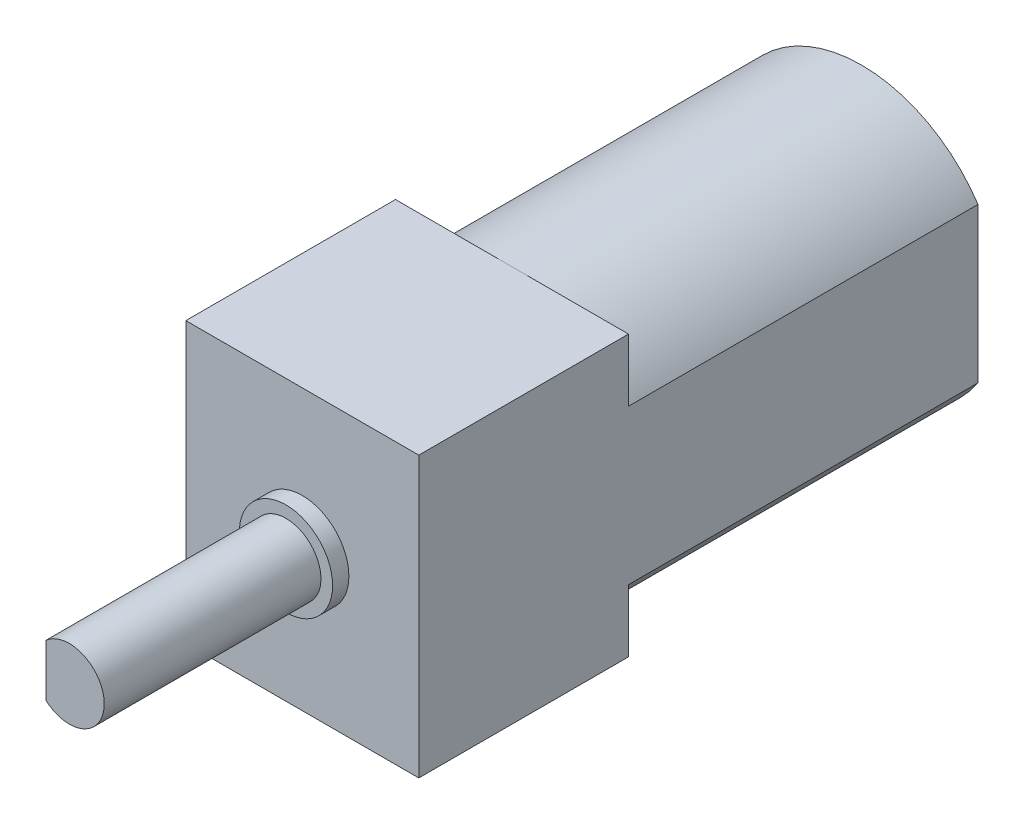
ISO-10303-21;
HEADER;
FILE_DESCRIPTION(('STEP AP214'),'2;1');
FILE_NAME('part.step','',(''),(''),'','','');
FILE_SCHEMA(('AUTOMOTIVE_DESIGN { 1 0 10303 214 1 1 1 1 }'));
ENDSEC;
DATA;
#1=APPLICATION_CONTEXT('core data for automotive mechanical design processes');
#2=APPLICATION_PROTOCOL_DEFINITION('international standard','automotive_design',2000,#1);
#3=PRODUCT_CONTEXT('',#1,'mechanical');
#4=PRODUCT('Part','Part','',(#3));
#5=PRODUCT_RELATED_PRODUCT_CATEGORY('part','',(#4));
#6=PRODUCT_DEFINITION_FORMATION('','',#4);
#7=PRODUCT_DEFINITION_CONTEXT('part definition',#1,'design');
#8=PRODUCT_DEFINITION('design','',#6,#7);
#9=PRODUCT_DEFINITION_SHAPE('','',#8);
#10=(LENGTH_UNIT() NAMED_UNIT(*) SI_UNIT(.MILLI.,.METRE.));
#11=(NAMED_UNIT(*) PLANE_ANGLE_UNIT() SI_UNIT($,.RADIAN.));
#12=(NAMED_UNIT(*) SI_UNIT($,.STERADIAN.) SOLID_ANGLE_UNIT());
#13=UNCERTAINTY_MEASURE_WITH_UNIT(LENGTH_MEASURE(1.E-05),#10,'distance_accuracy_value','');
#14=(GEOMETRIC_REPRESENTATION_CONTEXT(3) GLOBAL_UNCERTAINTY_ASSIGNED_CONTEXT((#13)) GLOBAL_UNIT_ASSIGNED_CONTEXT((#10,
#11,#12)) REPRESENTATION_CONTEXT('',''));
#15=CARTESIAN_POINT('',(0.,0.,0.));
#16=DIRECTION('',(0.,0.,1.));
#17=DIRECTION('',(1.,0.,0.));
#18=AXIS2_PLACEMENT_3D('',#15,#16,#17);
#19=CARTESIAN_POINT('',(5.,0.,24.));
#20=DIRECTION('',(-1.,0.,0.));
#21=DIRECTION('',(0.,0.,1.));
#22=AXIS2_PLACEMENT_3D('',#19,#20,#21);
#23=PLANE('',#22);
#24=DIRECTION('',(0.,-1.,0.));
#25=VECTOR('',#24,1.);
#26=CARTESIAN_POINT('',(5.,0.,15.));
#27=LINE('',#26,#25);
#28=CARTESIAN_POINT('',(5.,6.,15.));
#29=VERTEX_POINT('',#28);
#30=CARTESIAN_POINT('',(5.,3.3166247903554,15.));
#31=VERTEX_POINT('',#30);
#32=EDGE_CURVE('E143',#29,#31,#27,.T.);
#33=ORIENTED_EDGE('',*,*,#32,.F.);
#34=DIRECTION('',(0.,0.,-1.));
#35=VECTOR('',#34,1.);
#36=CARTESIAN_POINT('',(5.,6.,24.));
#37=LINE('',#36,#35);
#38=CARTESIAN_POINT('',(5.,6.,24.));
#39=VERTEX_POINT('',#38);
#40=EDGE_CURVE('E171',#39,#29,#37,.T.);
#41=ORIENTED_EDGE('',*,*,#40,.F.);
#42=DIRECTION('',(0.,1.,0.));
#43=VECTOR('',#42,1.);
#44=CARTESIAN_POINT('',(5.,-6.,24.));
#45=LINE('',#44,#43);
#46=CARTESIAN_POINT('',(5.,-6.,24.));
#47=VERTEX_POINT('',#46);
#48=EDGE_CURVE('E172',#47,#39,#45,.T.);
#49=ORIENTED_EDGE('',*,*,#48,.F.);
#50=DIRECTION('',(0.,0.,-1.));
#51=VECTOR('',#50,1.);
#52=CARTESIAN_POINT('',(5.,-6.,24.));
#53=LINE('',#52,#51);
#54=CARTESIAN_POINT('',(5.,-6.,15.));
#55=VERTEX_POINT('',#54);
#56=EDGE_CURVE('E184',#47,#55,#53,.T.);
#57=ORIENTED_EDGE('',*,*,#56,.T.);
#58=CARTESIAN_POINT('',(5.,-3.3166247903554,15.));
#59=VERTEX_POINT('',#58);
#60=EDGE_CURVE('E152',#59,#55,#27,.T.);
#61=ORIENTED_EDGE('',*,*,#60,.F.);
#62=DIRECTION('',(0.,0.,-1.));
#63=VECTOR('',#62,1.);
#64=CARTESIAN_POINT('',(5.,-3.3166247903554,15.));
#65=LINE('',#64,#63);
#66=CARTESIAN_POINT('',(5.,-3.3166247903554,0.));
#67=VERTEX_POINT('',#66);
#68=EDGE_CURVE('E246',#67,#59,#65,.F.);
#69=ORIENTED_EDGE('',*,*,#68,.F.);
#70=DIRECTION('',(0.,1.,0.));
#71=VECTOR('',#70,1.);
#72=CARTESIAN_POINT('',(5.,0.,0.));
#73=LINE('',#72,#71);
#74=CARTESIAN_POINT('',(5.,3.3166247903554,0.));
#75=VERTEX_POINT('',#74);
#76=EDGE_CURVE('E167',#67,#75,#73,.T.);
#77=ORIENTED_EDGE('',*,*,#76,.T.);
#78=DIRECTION('',(0.,0.,-1.));
#79=VECTOR('',#78,1.);
#80=CARTESIAN_POINT('',(5.,3.3166247903554,15.));
#81=LINE('',#80,#79);
#82=EDGE_CURVE('E224',#31,#75,#81,.T.);
#83=ORIENTED_EDGE('',*,*,#82,.F.);
#84=EDGE_LOOP('',(#33,#41,#49,#57,#61,#69,#77,#83));
#85=FACE_BOUND('',#84,.T.);
#86=ADVANCED_FACE('F45',(#85),#23,.F.);
#87=CARTESIAN_POINT('',(5.,6.,24.));
#88=DIRECTION('',(0.,-1.,0.));
#89=DIRECTION('',(1.,0.,0.));
#90=AXIS2_PLACEMENT_3D('',#87,#88,#89);
#91=PLANE('',#90);
#92=DIRECTION('',(1.,0.,0.));
#93=VECTOR('',#92,1.);
#94=CARTESIAN_POINT('',(5.,6.,15.));
#95=LINE('',#94,#93);
#96=CARTESIAN_POINT('',(-5.,6.,15.));
#97=VERTEX_POINT('',#96);
#98=CARTESIAN_POINT('',(0.,6.,15.));
#99=VERTEX_POINT('',#98);
#100=EDGE_CURVE('E155',#97,#99,#95,.T.);
#101=ORIENTED_EDGE('',*,*,#100,.F.);
#102=DIRECTION('',(0.,0.,-1.));
#103=VECTOR('',#102,1.);
#104=CARTESIAN_POINT('',(-5.,6.,24.));
#105=LINE('',#104,#103);
#106=CARTESIAN_POINT('',(-5.,6.,24.));
#107=VERTEX_POINT('',#106);
#108=EDGE_CURVE('E198',#107,#97,#105,.T.);
#109=ORIENTED_EDGE('',*,*,#108,.F.);
#110=DIRECTION('',(-1.,0.,0.));
#111=VECTOR('',#110,1.);
#112=CARTESIAN_POINT('',(5.,6.,24.));
#113=LINE('',#112,#111);
#114=EDGE_CURVE('E175',#39,#107,#113,.T.);
#115=ORIENTED_EDGE('',*,*,#114,.F.);
#116=ORIENTED_EDGE('',*,*,#40,.T.);
#117=EDGE_CURVE('E150',#99,#29,#95,.T.);
#118=ORIENTED_EDGE('',*,*,#117,.F.);
#119=EDGE_LOOP('',(#101,#109,#115,#116,#118));
#120=FACE_BOUND('',#119,.T.);
#121=ADVANCED_FACE('F277',(#120),#91,.F.);
#122=CARTESIAN_POINT('',(-5.,6.,24.));
#123=DIRECTION('',(1.,0.,0.));
#124=DIRECTION('',(0.,1.,0.));
#125=AXIS2_PLACEMENT_3D('',#122,#123,#124);
#126=PLANE('',#125);
#127=DIRECTION('',(0.,1.,0.));
#128=VECTOR('',#127,1.);
#129=CARTESIAN_POINT('',(-5.,6.,15.));
#130=LINE('',#129,#128);
#131=CARTESIAN_POINT('',(-5.,-6.,15.));
#132=VERTEX_POINT('',#131);
#133=CARTESIAN_POINT('',(-5.,-3.31662479035541,15.));
#134=VERTEX_POINT('',#133);
#135=EDGE_CURVE('E254',#132,#134,#130,.T.);
#136=ORIENTED_EDGE('',*,*,#135,.F.);
#137=DIRECTION('',(0.,0.,-1.));
#138=VECTOR('',#137,1.);
#139=CARTESIAN_POINT('',(-5.,-6.,24.));
#140=LINE('',#139,#138);
#141=CARTESIAN_POINT('',(-5.,-6.,24.));
#142=VERTEX_POINT('',#141);
#143=EDGE_CURVE('E194',#142,#132,#140,.T.);
#144=ORIENTED_EDGE('',*,*,#143,.F.);
#145=DIRECTION('',(0.,-1.,0.));
#146=VECTOR('',#145,1.);
#147=CARTESIAN_POINT('',(-5.,6.,24.));
#148=LINE('',#147,#146);
#149=EDGE_CURVE('E179',#107,#142,#148,.T.);
#150=ORIENTED_EDGE('',*,*,#149,.F.);
#151=ORIENTED_EDGE('',*,*,#108,.T.);
#152=CARTESIAN_POINT('',(-5.,3.3166247903554,15.));
#153=VERTEX_POINT('',#152);
#154=EDGE_CURVE('E232',#153,#97,#130,.T.);
#155=ORIENTED_EDGE('',*,*,#154,.F.);
#156=DIRECTION('',(0.,0.,-1.));
#157=VECTOR('',#156,1.);
#158=CARTESIAN_POINT('',(-5.,3.3166247903554,15.));
#159=LINE('',#158,#157);
#160=CARTESIAN_POINT('',(-5.,3.3166247903554,0.));
#161=VERTEX_POINT('',#160);
#162=EDGE_CURVE('E220',#161,#153,#159,.F.);
#163=ORIENTED_EDGE('',*,*,#162,.F.);
#164=DIRECTION('',(0.,-1.,0.));
#165=VECTOR('',#164,1.);
#166=CARTESIAN_POINT('',(-5.,6.,0.));
#167=LINE('',#166,#165);
#168=CARTESIAN_POINT('',(-5.,-3.31662479035541,0.));
#169=VERTEX_POINT('',#168);
#170=EDGE_CURVE('E176',#161,#169,#167,.T.);
#171=ORIENTED_EDGE('',*,*,#170,.T.);
#172=DIRECTION('',(0.,0.,-1.));
#173=VECTOR('',#172,1.);
#174=CARTESIAN_POINT('',(-5.,-3.31662479035541,15.));
#175=LINE('',#174,#173);
#176=EDGE_CURVE('E234',#134,#169,#175,.T.);
#177=ORIENTED_EDGE('',*,*,#176,.F.);
#178=EDGE_LOOP('',(#136,#144,#150,#151,#155,#163,#171,#177));
#179=FACE_BOUND('',#178,.T.);
#180=ADVANCED_FACE('F230',(#179),#126,.F.);
#181=CARTESIAN_POINT('',(-5.,-6.,24.));
#182=DIRECTION('',(0.,1.,0.));
#183=DIRECTION('',(0.,0.,1.));
#184=AXIS2_PLACEMENT_3D('',#181,#182,#183);
#185=PLANE('',#184);
#186=DIRECTION('',(-1.,0.,0.));
#187=VECTOR('',#186,1.);
#188=CARTESIAN_POINT('',(-5.,-6.,15.));
#189=LINE('',#188,#187);
#190=CARTESIAN_POINT('',(0.,-6.,15.));
#191=VERTEX_POINT('',#190);
#192=EDGE_CURVE('E53',#55,#191,#189,.T.);
#193=ORIENTED_EDGE('',*,*,#192,.F.);
#194=ORIENTED_EDGE('',*,*,#56,.F.);
#195=DIRECTION('',(1.,0.,0.));
#196=VECTOR('',#195,1.);
#197=CARTESIAN_POINT('',(-5.,-6.,24.));
#198=LINE('',#197,#196);
#199=EDGE_CURVE('E67',#142,#47,#198,.T.);
#200=ORIENTED_EDGE('',*,*,#199,.F.);
#201=ORIENTED_EDGE('',*,*,#143,.T.);
#202=EDGE_CURVE('E207',#191,#132,#189,.T.);
#203=ORIENTED_EDGE('',*,*,#202,.F.);
#204=EDGE_LOOP('',(#193,#194,#200,#201,#203));
#205=FACE_BOUND('',#204,.T.);
#206=ADVANCED_FACE('F283',(#205),#185,.F.);
#207=CARTESIAN_POINT('',(0.,0.,0.));
#208=DIRECTION('',(0.,0.,1.));
#209=DIRECTION('',(1.,0.,0.));
#210=AXIS2_PLACEMENT_3D('',#207,#208,#209);
#211=PLANE('',#210);
#212=CARTESIAN_POINT('',(0.,0.,0.));
#213=DIRECTION('',(0.,0.,-1.));
#214=DIRECTION('',(-1.,0.,0.));
#215=AXIS2_PLACEMENT_3D('',#212,#213,#214);
#216=CIRCLE('',#215,2.5);
#217=CARTESIAN_POINT('',(-2.5,0.,0.));
#218=VERTEX_POINT('',#217);
#219=EDGE_CURVE('E163',#218,#218,#216,.T.);
#220=ORIENTED_EDGE('',*,*,#219,.F.);
#221=EDGE_LOOP('',(#220));
#222=FACE_BOUND('',#221,.T.);
#223=CARTESIAN_POINT('',(0.,0.,0.));
#224=DIRECTION('',(0.,0.,1.));
#225=DIRECTION('',(1.,0.,0.));
#226=AXIS2_PLACEMENT_3D('',#223,#224,#225);
#227=CIRCLE('',#226,6.);
#228=EDGE_CURVE('E206',#75,#161,#227,.T.);
#229=ORIENTED_EDGE('',*,*,#228,.F.);
#230=ORIENTED_EDGE('',*,*,#76,.F.);
#231=EDGE_CURVE('E157',#169,#67,#227,.T.);
#232=ORIENTED_EDGE('',*,*,#231,.F.);
#233=ORIENTED_EDGE('',*,*,#170,.F.);
#234=EDGE_LOOP('',(#229,#230,#232,#233));
#235=FACE_BOUND('',#234,.T.);
#236=ADVANCED_FACE('F237',(#222,#235),#211,.F.);
#237=CARTESIAN_POINT('',(0.,0.,24.));
#238=DIRECTION('',(0.,0.,1.));
#239=DIRECTION('',(1.,0.,0.));
#240=AXIS2_PLACEMENT_3D('',#237,#238,#239);
#241=PLANE('',#240);
#242=CARTESIAN_POINT('',(0.,0.,24.));
#243=DIRECTION('',(0.,0.,1.));
#244=DIRECTION('',(1.,0.,0.));
#245=AXIS2_PLACEMENT_3D('',#242,#243,#244);
#246=CIRCLE('',#245,2.);
#247=CARTESIAN_POINT('',(2.,0.,24.));
#248=VERTEX_POINT('',#247);
#249=EDGE_CURVE('E158',#248,#248,#246,.T.);
#250=ORIENTED_EDGE('',*,*,#249,.F.);
#251=EDGE_LOOP('',(#250));
#252=FACE_BOUND('',#251,.T.);
#253=ORIENTED_EDGE('',*,*,#48,.T.);
#254=ORIENTED_EDGE('',*,*,#114,.T.);
#255=ORIENTED_EDGE('',*,*,#149,.T.);
#256=ORIENTED_EDGE('',*,*,#199,.T.);
#257=EDGE_LOOP('',(#253,#254,#255,#256));
#258=FACE_BOUND('',#257,.T.);
#259=ADVANCED_FACE('F280',(#252,#258),#241,.T.);
#260=CARTESIAN_POINT('',(0.,0.,-1.2));
#261=DIRECTION('',(0.,0.,1.));
#262=DIRECTION('',(1.,0.,0.));
#263=AXIS2_PLACEMENT_3D('',#260,#261,#262);
#264=CYLINDRICAL_SURFACE('',#263,2.5);
#265=CARTESIAN_POINT('',(0.,0.,-1.2));
#266=DIRECTION('',(0.,0.,-1.));
#267=DIRECTION('',(-1.,0.,0.));
#268=AXIS2_PLACEMENT_3D('',#265,#266,#267);
#269=CIRCLE('',#268,2.5);
#270=CARTESIAN_POINT('',(-2.5,0.,-1.2));
#271=VERTEX_POINT('',#270);
#272=EDGE_CURVE('E148',#271,#271,#269,.T.);
#273=ORIENTED_EDGE('',*,*,#272,.F.);
#274=EDGE_LOOP('',(#273));
#275=FACE_BOUND('',#274,.T.);
#276=ORIENTED_EDGE('',*,*,#219,.T.);
#277=EDGE_LOOP('',(#276));
#278=FACE_BOUND('',#277,.T.);
#279=ADVANCED_FACE('F310',(#275,#278),#264,.T.);
#280=CARTESIAN_POINT('',(0.,0.,-1.2));
#281=DIRECTION('',(0.,0.,-1.));
#282=DIRECTION('',(-1.,0.,0.));
#283=AXIS2_PLACEMENT_3D('',#280,#281,#282);
#284=PLANE('',#283);
#285=ORIENTED_EDGE('',*,*,#272,.T.);
#286=EDGE_LOOP('',(#285));
#287=FACE_BOUND('',#286,.T.);
#288=ADVANCED_FACE('F305',(#287),#284,.T.);
#289=CARTESIAN_POINT('',(0.,0.,24.7));
#290=DIRECTION('',(0.,0.,-1.));
#291=DIRECTION('',(-1.,0.,0.));
#292=AXIS2_PLACEMENT_3D('',#289,#290,#291);
#293=CYLINDRICAL_SURFACE('',#292,2.);
#294=CARTESIAN_POINT('',(0.,0.,24.7));
#295=DIRECTION('',(0.,0.,1.));
#296=DIRECTION('',(1.,0.,0.));
#297=AXIS2_PLACEMENT_3D('',#294,#295,#296);
#298=CIRCLE('',#297,2.);
#299=CARTESIAN_POINT('',(2.,0.,24.7));
#300=VERTEX_POINT('',#299);
#301=EDGE_CURVE('E142',#300,#300,#298,.T.);
#302=ORIENTED_EDGE('',*,*,#301,.F.);
#303=EDGE_LOOP('',(#302));
#304=FACE_BOUND('',#303,.T.);
#305=ORIENTED_EDGE('',*,*,#249,.T.);
#306=EDGE_LOOP('',(#305));
#307=FACE_BOUND('',#306,.T.);
#308=ADVANCED_FACE('F299',(#304,#307),#293,.T.);
#309=CARTESIAN_POINT('',(0.,0.,24.7));
#310=DIRECTION('',(0.,0.,1.));
#311=DIRECTION('',(1.,0.,0.));
#312=AXIS2_PLACEMENT_3D('',#309,#310,#311);
#313=PLANE('',#312);
#314=CARTESIAN_POINT('',(0.,0.,24.7));
#315=DIRECTION('',(0.,0.,1.));
#316=DIRECTION('',(1.,0.,0.));
#317=AXIS2_PLACEMENT_3D('',#314,#315,#316);
#318=CIRCLE('',#317,1.5);
#319=CARTESIAN_POINT('',(-1.,-1.1180339887499,24.7));
#320=VERTEX_POINT('',#319);
#321=CARTESIAN_POINT('',(-1.,1.1180339887499,24.7));
#322=VERTEX_POINT('',#321);
#323=EDGE_CURVE('E136',#320,#322,#318,.T.);
#324=ORIENTED_EDGE('',*,*,#323,.F.);
#325=DIRECTION('',(0.,1.,0.));
#326=VECTOR('',#325,1.);
#327=CARTESIAN_POINT('',(-1.,-2.21123093245202,24.7));
#328=LINE('',#327,#326);
#329=EDGE_CURVE('E138',#320,#322,#328,.T.);
#330=ORIENTED_EDGE('',*,*,#329,.T.);
#331=EDGE_LOOP('',(#324,#330));
#332=FACE_BOUND('',#331,.T.);
#333=ORIENTED_EDGE('',*,*,#301,.T.);
#334=EDGE_LOOP('',(#333));
#335=FACE_BOUND('',#334,.T.);
#336=ADVANCED_FACE('F296',(#332,#335),#313,.T.);
#337=CARTESIAN_POINT('',(0.,0.,34.));
#338=DIRECTION('',(0.,0.,-1.));
#339=DIRECTION('',(-1.,0.,0.));
#340=AXIS2_PLACEMENT_3D('',#337,#338,#339);
#341=CYLINDRICAL_SURFACE('',#340,1.5);
#342=CARTESIAN_POINT('',(0.,0.,34.));
#343=DIRECTION('',(0.,0.,1.));
#344=DIRECTION('',(1.,0.,0.));
#345=AXIS2_PLACEMENT_3D('',#342,#343,#344);
#346=CIRCLE('',#345,1.5);
#347=CARTESIAN_POINT('',(-1.,-1.1180339887499,34.));
#348=VERTEX_POINT('',#347);
#349=CARTESIAN_POINT('',(-1.,1.1180339887499,34.));
#350=VERTEX_POINT('',#349);
#351=EDGE_CURVE('E134',#348,#350,#346,.T.);
#352=ORIENTED_EDGE('',*,*,#351,.F.);
#353=DIRECTION('',(0.,0.,-1.));
#354=VECTOR('',#353,1.);
#355=CARTESIAN_POINT('',(-1.,-1.1180339887499,34.));
#356=LINE('',#355,#354);
#357=EDGE_CURVE('E59',#348,#320,#356,.T.);
#358=ORIENTED_EDGE('',*,*,#357,.T.);
#359=ORIENTED_EDGE('',*,*,#323,.T.);
#360=DIRECTION('',(0.,0.,-1.));
#361=VECTOR('',#360,1.);
#362=CARTESIAN_POINT('',(-1.,1.1180339887499,34.));
#363=LINE('',#362,#361);
#364=EDGE_CURVE('E126',#322,#350,#363,.F.);
#365=ORIENTED_EDGE('',*,*,#364,.T.);
#366=EDGE_LOOP('',(#352,#358,#359,#365));
#367=FACE_BOUND('',#366,.T.);
#368=ADVANCED_FACE('F133',(#367),#341,.T.);
#369=CARTESIAN_POINT('',(0.,0.,34.));
#370=DIRECTION('',(0.,0.,1.));
#371=DIRECTION('',(1.,0.,0.));
#372=AXIS2_PLACEMENT_3D('',#369,#370,#371);
#373=PLANE('',#372);
#374=DIRECTION('',(0.,1.,0.));
#375=VECTOR('',#374,1.);
#376=CARTESIAN_POINT('',(-1.,0.,34.));
#377=LINE('',#376,#375);
#378=EDGE_CURVE('E12',#348,#350,#377,.T.);
#379=ORIENTED_EDGE('',*,*,#378,.F.);
#380=ORIENTED_EDGE('',*,*,#351,.T.);
#381=EDGE_LOOP('',(#379,#380));
#382=FACE_BOUND('',#381,.T.);
#383=ADVANCED_FACE('F140',(#382),#373,.T.);
#384=CARTESIAN_POINT('',(0.,0.,15.));
#385=DIRECTION('',(0.,0.,-1.));
#386=DIRECTION('',(-1.,0.,0.));
#387=AXIS2_PLACEMENT_3D('',#384,#385,#386);
#388=CYLINDRICAL_SURFACE('',#387,6.);
#389=ORIENTED_EDGE('',*,*,#68,.T.);
#390=CARTESIAN_POINT('',(0.,0.,15.));
#391=DIRECTION('',(0.,0.,-1.));
#392=DIRECTION('',(-1.,0.,0.));
#393=AXIS2_PLACEMENT_3D('',#390,#391,#392);
#394=CIRCLE('',#393,6.);
#395=EDGE_CURVE('E285',#59,#191,#394,.T.);
#396=ORIENTED_EDGE('',*,*,#395,.T.);
#397=EDGE_CURVE('E244',#191,#134,#394,.T.);
#398=ORIENTED_EDGE('',*,*,#397,.T.);
#399=ORIENTED_EDGE('',*,*,#176,.T.);
#400=ORIENTED_EDGE('',*,*,#231,.T.);
#401=EDGE_LOOP('',(#389,#396,#398,#399,#400));
#402=FACE_BOUND('',#401,.T.);
#403=ADVANCED_FACE('F242',(#402),#388,.T.);
#404=CARTESIAN_POINT('',(0.,0.,15.));
#405=DIRECTION('',(0.,0.,-1.));
#406=DIRECTION('',(-1.,0.,0.));
#407=AXIS2_PLACEMENT_3D('',#404,#405,#406);
#408=PLANE('',#407);
#409=ORIENTED_EDGE('',*,*,#135,.T.);
#410=ORIENTED_EDGE('',*,*,#397,.F.);
#411=ORIENTED_EDGE('',*,*,#202,.T.);
#412=EDGE_LOOP('',(#409,#410,#411));
#413=FACE_BOUND('',#412,.T.);
#414=ADVANCED_FACE('F286',(#413),#408,.T.);
#415=ORIENTED_EDGE('',*,*,#60,.T.);
#416=ORIENTED_EDGE('',*,*,#192,.T.);
#417=ORIENTED_EDGE('',*,*,#395,.F.);
#418=EDGE_LOOP('',(#415,#416,#417));
#419=FACE_BOUND('',#418,.T.);
#420=ADVANCED_FACE('F284',(#419),#408,.T.);
#421=ORIENTED_EDGE('',*,*,#32,.T.);
#422=EDGE_CURVE('E271',#99,#31,#394,.T.);
#423=ORIENTED_EDGE('',*,*,#422,.F.);
#424=ORIENTED_EDGE('',*,*,#117,.T.);
#425=EDGE_LOOP('',(#421,#423,#424));
#426=FACE_BOUND('',#425,.T.);
#427=ADVANCED_FACE('F270',(#426),#408,.T.);
#428=ORIENTED_EDGE('',*,*,#100,.T.);
#429=EDGE_CURVE('E235',#153,#99,#394,.T.);
#430=ORIENTED_EDGE('',*,*,#429,.F.);
#431=ORIENTED_EDGE('',*,*,#154,.T.);
#432=EDGE_LOOP('',(#428,#430,#431));
#433=FACE_BOUND('',#432,.T.);
#434=ADVANCED_FACE('F366',(#433),#408,.T.);
#435=ORIENTED_EDGE('',*,*,#82,.T.);
#436=ORIENTED_EDGE('',*,*,#228,.T.);
#437=ORIENTED_EDGE('',*,*,#162,.T.);
#438=ORIENTED_EDGE('',*,*,#429,.T.);
#439=ORIENTED_EDGE('',*,*,#422,.T.);
#440=EDGE_LOOP('',(#435,#436,#437,#438,#439));
#441=FACE_BOUND('',#440,.T.);
#442=ADVANCED_FACE('F218',(#441),#388,.T.);
#443=CARTESIAN_POINT('',(-1.,0.,24.7));
#444=DIRECTION('',(1.,0.,0.));
#445=DIRECTION('',(0.,0.,-1.));
#446=AXIS2_PLACEMENT_3D('',#443,#444,#445);
#447=PLANE('',#446);
#448=ORIENTED_EDGE('',*,*,#378,.T.);
#449=ORIENTED_EDGE('',*,*,#364,.F.);
#450=ORIENTED_EDGE('',*,*,#329,.F.);
#451=ORIENTED_EDGE('',*,*,#357,.F.);
#452=EDGE_LOOP('',(#448,#449,#450,#451));
#453=FACE_BOUND('',#452,.T.);
#454=ADVANCED_FACE('F125',(#453),#447,.F.);
#455=CLOSED_SHELL('',(#86,#121,#180,#206,#236,#259,#279,#288,#308,#336,#368,#383,#403,#414,#420,
#427,#434,#442,#454));
#456=MANIFOLD_SOLID_BREP('B2',#455);
#457=ADVANCED_BREP_SHAPE_REPRESENTATION('',(#18,#456),#14);
#458=SHAPE_DEFINITION_REPRESENTATION(#9,#457);
ENDSEC;
END-ISO-10303-21;
